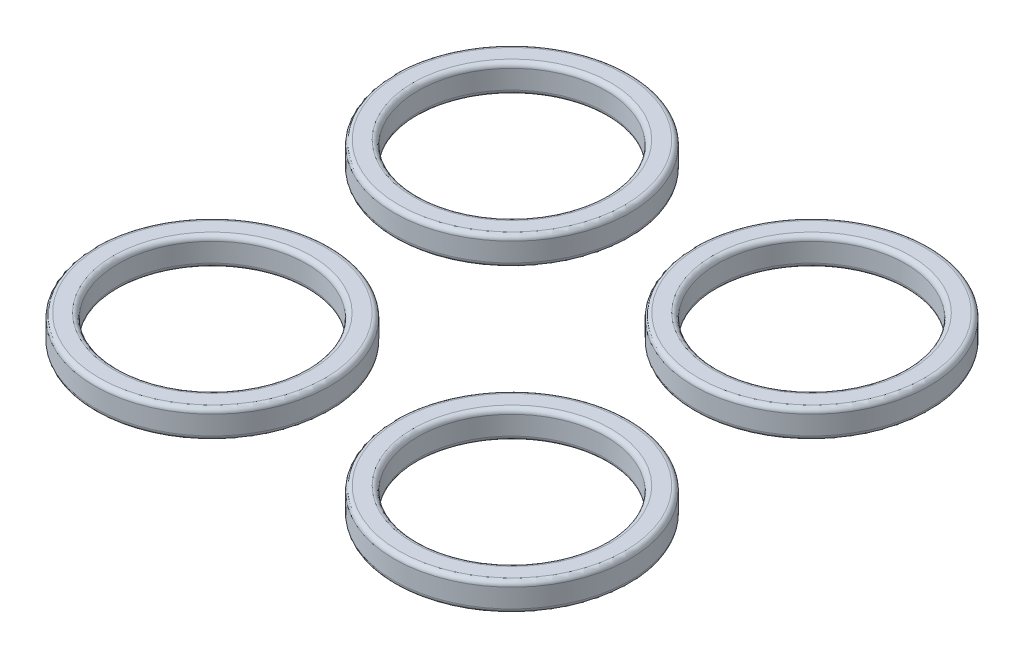
ISO-10303-21;
HEADER;
FILE_DESCRIPTION(('STEP AP214'),'2;1');
FILE_NAME('part.step','',(''),(''),'','','');
FILE_SCHEMA(('AUTOMOTIVE_DESIGN { 1 0 10303 214 1 1 1 1 }'));
ENDSEC;
DATA;
#1=APPLICATION_CONTEXT('core data for automotive mechanical design processes');
#2=APPLICATION_PROTOCOL_DEFINITION('international standard','automotive_design',2000,#1);
#3=PRODUCT_CONTEXT('',#1,'mechanical');
#4=PRODUCT('Part','Part','',(#3));
#5=PRODUCT_RELATED_PRODUCT_CATEGORY('part','',(#4));
#6=PRODUCT_DEFINITION_FORMATION('','',#4);
#7=PRODUCT_DEFINITION_CONTEXT('part definition',#1,'design');
#8=PRODUCT_DEFINITION('design','',#6,#7);
#9=PRODUCT_DEFINITION_SHAPE('','',#8);
#10=(LENGTH_UNIT() NAMED_UNIT(*) SI_UNIT(.MILLI.,.METRE.));
#11=(NAMED_UNIT(*) PLANE_ANGLE_UNIT() SI_UNIT($,.RADIAN.));
#12=(NAMED_UNIT(*) SI_UNIT($,.STERADIAN.) SOLID_ANGLE_UNIT());
#13=UNCERTAINTY_MEASURE_WITH_UNIT(LENGTH_MEASURE(1.E-05),#10,'distance_accuracy_value','');
#14=(GEOMETRIC_REPRESENTATION_CONTEXT(3) GLOBAL_UNCERTAINTY_ASSIGNED_CONTEXT((#13)) GLOBAL_UNIT_ASSIGNED_CONTEXT((#10,
#11,#12)) REPRESENTATION_CONTEXT('',''));
#15=CARTESIAN_POINT('',(0.,0.,0.));
#16=DIRECTION('',(0.,0.,1.));
#17=DIRECTION('',(1.,0.,0.));
#18=AXIS2_PLACEMENT_3D('',#15,#16,#17);
#19=CARTESIAN_POINT('',(159.099025766973,30.,159.099025766973));
#20=DIRECTION('',(0.,1.,0.));
#21=DIRECTION('',(0.,0.,1.));
#22=AXIS2_PLACEMENT_3D('',#19,#20,#21);
#23=PLANE('',#22);
#24=CARTESIAN_POINT('',(159.099025766973,30.,159.099025766973));
#25=DIRECTION('',(0.,1.,0.));
#26=DIRECTION('',(0.,0.,1.));
#27=AXIS2_PLACEMENT_3D('',#24,#25,#26);
#28=CIRCLE('',#27,105.);
#29=CARTESIAN_POINT('',(159.099025766973,30.,264.099025766973));
#30=VERTEX_POINT('',#29);
#31=EDGE_CURVE('E11',#30,#30,#28,.F.);
#32=ORIENTED_EDGE('',*,*,#31,.T.);
#33=EDGE_LOOP('',(#32));
#34=FACE_BOUND('',#33,.T.);
#35=CARTESIAN_POINT('',(159.099025766973,30.,159.099025766973));
#36=DIRECTION('',(0.,1.,0.));
#37=DIRECTION('',(0.,0.,1.));
#38=AXIS2_PLACEMENT_3D('',#35,#36,#37);
#39=CIRCLE('',#38,120.);
#40=CARTESIAN_POINT('',(159.099025766973,30.,279.099025766974));
#41=VERTEX_POINT('',#40);
#42=EDGE_CURVE('E47',#41,#41,#39,.T.);
#43=ORIENTED_EDGE('',*,*,#42,.T.);
#44=EDGE_LOOP('',(#43));
#45=FACE_BOUND('',#44,.T.);
#46=ADVANCED_FACE('F40',(#34,#45),#23,.T.);
#47=CARTESIAN_POINT('',(159.099025766973,0.,159.099025766973));
#48=DIRECTION('',(0.,1.,0.));
#49=DIRECTION('',(0.,0.,1.));
#50=AXIS2_PLACEMENT_3D('',#47,#48,#49);
#51=PLANE('',#50);
#52=CARTESIAN_POINT('',(159.099025766973,0.,159.099025766973));
#53=DIRECTION('',(0.,1.,0.));
#54=DIRECTION('',(0.,0.,1.));
#55=AXIS2_PLACEMENT_3D('',#52,#53,#54);
#56=CIRCLE('',#55,105.);
#57=CARTESIAN_POINT('',(159.099025766973,0.,264.099025766973));
#58=VERTEX_POINT('',#57);
#59=EDGE_CURVE('E66',#58,#58,#56,.T.);
#60=ORIENTED_EDGE('',*,*,#59,.T.);
#61=EDGE_LOOP('',(#60));
#62=FACE_BOUND('',#61,.T.);
#63=CARTESIAN_POINT('',(159.099025766973,0.,159.099025766973));
#64=DIRECTION('',(0.,1.,0.));
#65=DIRECTION('',(0.,0.,1.));
#66=AXIS2_PLACEMENT_3D('',#63,#64,#65);
#67=CIRCLE('',#66,120.);
#68=CARTESIAN_POINT('',(159.099025766973,0.,279.099025766974));
#69=VERTEX_POINT('',#68);
#70=EDGE_CURVE('E69',#69,#69,#67,.F.);
#71=ORIENTED_EDGE('',*,*,#70,.T.);
#72=EDGE_LOOP('',(#71));
#73=FACE_BOUND('',#72,.T.);
#74=ADVANCED_FACE('F73',(#62,#73),#51,.F.);
#75=CARTESIAN_POINT('',(159.099025766973,30.,159.099025766973));
#76=DIRECTION('',(0.,-1.,0.));
#77=DIRECTION('',(0.,0.,-1.));
#78=AXIS2_PLACEMENT_3D('',#75,#76,#77);
#79=CYLINDRICAL_SURFACE('',#78,125.);
#80=CARTESIAN_POINT('',(159.099025766973,5.,159.099025766973));
#81=DIRECTION('',(0.,1.,0.));
#82=DIRECTION('',(0.,0.,1.));
#83=AXIS2_PLACEMENT_3D('',#80,#81,#82);
#84=CIRCLE('',#83,125.);
#85=CARTESIAN_POINT('',(159.099025766973,5.,284.099025766974));
#86=VERTEX_POINT('',#85);
#87=EDGE_CURVE('E51',#86,#86,#84,.T.);
#88=ORIENTED_EDGE('',*,*,#87,.T.);
#89=EDGE_LOOP('',(#88));
#90=FACE_BOUND('',#89,.T.);
#91=CARTESIAN_POINT('',(159.099025766973,25.,159.099025766973));
#92=DIRECTION('',(0.,1.,0.));
#93=DIRECTION('',(0.,0.,1.));
#94=AXIS2_PLACEMENT_3D('',#91,#92,#93);
#95=CIRCLE('',#94,125.);
#96=CARTESIAN_POINT('',(159.099025766973,25.,284.099025766974));
#97=VERTEX_POINT('',#96);
#98=EDGE_CURVE('E55',#97,#97,#95,.F.);
#99=ORIENTED_EDGE('',*,*,#98,.T.);
#100=EDGE_LOOP('',(#99));
#101=FACE_BOUND('',#100,.T.);
#102=ADVANCED_FACE('F83',(#90,#101),#79,.T.);
#103=CARTESIAN_POINT('',(159.099025766973,30.,159.099025766973));
#104=DIRECTION('',(0.,-1.,0.));
#105=DIRECTION('',(0.,0.,-1.));
#106=AXIS2_PLACEMENT_3D('',#103,#104,#105);
#107=CYLINDRICAL_SURFACE('',#106,100.);
#108=CARTESIAN_POINT('',(159.099025766973,5.,159.099025766973));
#109=DIRECTION('',(0.,1.,0.));
#110=DIRECTION('',(0.,0.,1.));
#111=AXIS2_PLACEMENT_3D('',#108,#109,#110);
#112=CIRCLE('',#111,100.);
#113=CARTESIAN_POINT('',(159.099025766973,5.,259.099025766973));
#114=VERTEX_POINT('',#113);
#115=EDGE_CURVE('E60',#114,#114,#112,.F.);
#116=ORIENTED_EDGE('',*,*,#115,.T.);
#117=EDGE_LOOP('',(#116));
#118=FACE_BOUND('',#117,.T.);
#119=CARTESIAN_POINT('',(159.099025766973,25.,159.099025766973));
#120=DIRECTION('',(0.,1.,0.));
#121=DIRECTION('',(0.,0.,1.));
#122=AXIS2_PLACEMENT_3D('',#119,#120,#121);
#123=CIRCLE('',#122,100.);
#124=CARTESIAN_POINT('',(159.099025766973,25.,259.099025766973));
#125=VERTEX_POINT('',#124);
#126=EDGE_CURVE('E63',#125,#125,#123,.T.);
#127=ORIENTED_EDGE('',*,*,#126,.T.);
#128=EDGE_LOOP('',(#127));
#129=FACE_BOUND('',#128,.T.);
#130=ADVANCED_FACE('F86',(#118,#129),#107,.F.);
#131=CARTESIAN_POINT('',(159.099025766973,5.,159.099025766973));
#132=DIRECTION('',(0.,1.,0.));
#133=DIRECTION('',(0.,0.,1.));
#134=AXIS2_PLACEMENT_3D('',#131,#132,#133);
#135=TOROIDAL_SURFACE('',#134,105.,5.);
#136=ORIENTED_EDGE('',*,*,#115,.F.);
#137=EDGE_LOOP('',(#136));
#138=FACE_BOUND('',#137,.T.);
#139=ORIENTED_EDGE('',*,*,#59,.F.);
#140=EDGE_LOOP('',(#139));
#141=FACE_BOUND('',#140,.T.);
#142=ADVANCED_FACE('F79',(#138,#141),#135,.T.);
#143=CARTESIAN_POINT('',(159.099025766973,5.,159.099025766973));
#144=DIRECTION('',(0.,1.,0.));
#145=DIRECTION('',(0.,0.,1.));
#146=AXIS2_PLACEMENT_3D('',#143,#144,#145);
#147=TOROIDAL_SURFACE('',#146,120.,5.);
#148=ORIENTED_EDGE('',*,*,#70,.F.);
#149=EDGE_LOOP('',(#148));
#150=FACE_BOUND('',#149,.T.);
#151=ORIENTED_EDGE('',*,*,#87,.F.);
#152=EDGE_LOOP('',(#151));
#153=FACE_BOUND('',#152,.T.);
#154=ADVANCED_FACE('F75',(#150,#153),#147,.T.);
#155=CARTESIAN_POINT('',(159.099025766973,25.,159.099025766973));
#156=DIRECTION('',(0.,1.,0.));
#157=DIRECTION('',(0.,0.,1.));
#158=AXIS2_PLACEMENT_3D('',#155,#156,#157);
#159=TOROIDAL_SURFACE('',#158,105.,5.);
#160=ORIENTED_EDGE('',*,*,#31,.F.);
#161=EDGE_LOOP('',(#160));
#162=FACE_BOUND('',#161,.T.);
#163=ORIENTED_EDGE('',*,*,#126,.F.);
#164=EDGE_LOOP('',(#163));
#165=FACE_BOUND('',#164,.T.);
#166=ADVANCED_FACE('F78',(#162,#165),#159,.T.);
#167=CARTESIAN_POINT('',(159.099025766973,25.,159.099025766973));
#168=DIRECTION('',(0.,1.,0.));
#169=DIRECTION('',(0.,0.,1.));
#170=AXIS2_PLACEMENT_3D('',#167,#168,#169);
#171=TOROIDAL_SURFACE('',#170,120.,5.);
#172=ORIENTED_EDGE('',*,*,#98,.F.);
#173=EDGE_LOOP('',(#172));
#174=FACE_BOUND('',#173,.T.);
#175=ORIENTED_EDGE('',*,*,#42,.F.);
#176=EDGE_LOOP('',(#175));
#177=FACE_BOUND('',#176,.T.);
#178=ADVANCED_FACE('F42',(#174,#177),#171,.T.);
#179=CLOSED_SHELL('',(#46,#74,#102,#130,#142,#154,#166,#178));
#180=MANIFOLD_SOLID_BREP('B2',#179);
#181=CARTESIAN_POINT('',(-159.099025766973,30.,159.099025766973));
#182=DIRECTION('',(0.,1.,0.));
#183=DIRECTION('',(0.,0.,1.));
#184=AXIS2_PLACEMENT_3D('',#181,#182,#183);
#185=PLANE('',#184);
#186=CARTESIAN_POINT('',(-159.099025766973,30.,159.099025766973));
#187=DIRECTION('',(0.,1.,0.));
#188=DIRECTION('',(0.,0.,1.));
#189=AXIS2_PLACEMENT_3D('',#186,#187,#188);
#190=CIRCLE('',#189,105.);
#191=CARTESIAN_POINT('',(-159.099025766973,30.,264.099025766973));
#192=VERTEX_POINT('',#191);
#193=EDGE_CURVE('E39',#192,#192,#190,.F.);
#194=ORIENTED_EDGE('',*,*,#193,.T.);
#195=EDGE_LOOP('',(#194));
#196=FACE_BOUND('',#195,.T.);
#197=CARTESIAN_POINT('',(-159.099025766973,30.,159.099025766973));
#198=DIRECTION('',(0.,1.,0.));
#199=DIRECTION('',(0.,0.,1.));
#200=AXIS2_PLACEMENT_3D('',#197,#198,#199);
#201=CIRCLE('',#200,120.);
#202=CARTESIAN_POINT('',(-159.099025766973,30.,279.099025766973));
#203=VERTEX_POINT('',#202);
#204=EDGE_CURVE('E177',#203,#203,#201,.T.);
#205=ORIENTED_EDGE('',*,*,#204,.T.);
#206=EDGE_LOOP('',(#205));
#207=FACE_BOUND('',#206,.T.);
#208=ADVANCED_FACE('F170',(#196,#207),#185,.T.);
#209=CARTESIAN_POINT('',(-159.099025766973,0.,159.099025766973));
#210=DIRECTION('',(0.,1.,0.));
#211=DIRECTION('',(0.,0.,1.));
#212=AXIS2_PLACEMENT_3D('',#209,#210,#211);
#213=PLANE('',#212);
#214=CARTESIAN_POINT('',(-159.099025766973,0.,159.099025766973));
#215=DIRECTION('',(0.,1.,0.));
#216=DIRECTION('',(0.,0.,1.));
#217=AXIS2_PLACEMENT_3D('',#214,#215,#216);
#218=CIRCLE('',#217,105.);
#219=CARTESIAN_POINT('',(-159.099025766973,0.,264.099025766973));
#220=VERTEX_POINT('',#219);
#221=EDGE_CURVE('E196',#220,#220,#218,.T.);
#222=ORIENTED_EDGE('',*,*,#221,.T.);
#223=EDGE_LOOP('',(#222));
#224=FACE_BOUND('',#223,.T.);
#225=CARTESIAN_POINT('',(-159.099025766973,0.,159.099025766973));
#226=DIRECTION('',(0.,1.,0.));
#227=DIRECTION('',(0.,0.,1.));
#228=AXIS2_PLACEMENT_3D('',#225,#226,#227);
#229=CIRCLE('',#228,120.);
#230=CARTESIAN_POINT('',(-159.099025766973,0.,279.099025766973));
#231=VERTEX_POINT('',#230);
#232=EDGE_CURVE('E199',#231,#231,#229,.F.);
#233=ORIENTED_EDGE('',*,*,#232,.T.);
#234=EDGE_LOOP('',(#233));
#235=FACE_BOUND('',#234,.T.);
#236=ADVANCED_FACE('F203',(#224,#235),#213,.F.);
#237=CARTESIAN_POINT('',(-159.099025766973,30.,159.099025766973));
#238=DIRECTION('',(0.,-1.,0.));
#239=DIRECTION('',(0.,0.,-1.));
#240=AXIS2_PLACEMENT_3D('',#237,#238,#239);
#241=CYLINDRICAL_SURFACE('',#240,125.);
#242=CARTESIAN_POINT('',(-159.099025766973,5.,159.099025766973));
#243=DIRECTION('',(0.,1.,0.));
#244=DIRECTION('',(0.,0.,1.));
#245=AXIS2_PLACEMENT_3D('',#242,#243,#244);
#246=CIRCLE('',#245,125.);
#247=CARTESIAN_POINT('',(-159.099025766973,5.,284.099025766973));
#248=VERTEX_POINT('',#247);
#249=EDGE_CURVE('E181',#248,#248,#246,.T.);
#250=ORIENTED_EDGE('',*,*,#249,.T.);
#251=EDGE_LOOP('',(#250));
#252=FACE_BOUND('',#251,.T.);
#253=CARTESIAN_POINT('',(-159.099025766973,25.,159.099025766973));
#254=DIRECTION('',(0.,1.,0.));
#255=DIRECTION('',(0.,0.,1.));
#256=AXIS2_PLACEMENT_3D('',#253,#254,#255);
#257=CIRCLE('',#256,125.);
#258=CARTESIAN_POINT('',(-159.099025766973,25.,284.099025766973));
#259=VERTEX_POINT('',#258);
#260=EDGE_CURVE('E185',#259,#259,#257,.F.);
#261=ORIENTED_EDGE('',*,*,#260,.T.);
#262=EDGE_LOOP('',(#261));
#263=FACE_BOUND('',#262,.T.);
#264=ADVANCED_FACE('F213',(#252,#263),#241,.T.);
#265=CARTESIAN_POINT('',(-159.099025766973,30.,159.099025766973));
#266=DIRECTION('',(0.,-1.,0.));
#267=DIRECTION('',(0.,0.,-1.));
#268=AXIS2_PLACEMENT_3D('',#265,#266,#267);
#269=CYLINDRICAL_SURFACE('',#268,100.);
#270=CARTESIAN_POINT('',(-159.099025766973,5.,159.099025766973));
#271=DIRECTION('',(0.,1.,0.));
#272=DIRECTION('',(0.,0.,1.));
#273=AXIS2_PLACEMENT_3D('',#270,#271,#272);
#274=CIRCLE('',#273,100.);
#275=CARTESIAN_POINT('',(-159.099025766973,5.,259.099025766973));
#276=VERTEX_POINT('',#275);
#277=EDGE_CURVE('E190',#276,#276,#274,.F.);
#278=ORIENTED_EDGE('',*,*,#277,.T.);
#279=EDGE_LOOP('',(#278));
#280=FACE_BOUND('',#279,.T.);
#281=CARTESIAN_POINT('',(-159.099025766973,25.,159.099025766973));
#282=DIRECTION('',(0.,1.,0.));
#283=DIRECTION('',(0.,0.,1.));
#284=AXIS2_PLACEMENT_3D('',#281,#282,#283);
#285=CIRCLE('',#284,100.);
#286=CARTESIAN_POINT('',(-159.099025766973,25.,259.099025766973));
#287=VERTEX_POINT('',#286);
#288=EDGE_CURVE('E193',#287,#287,#285,.T.);
#289=ORIENTED_EDGE('',*,*,#288,.T.);
#290=EDGE_LOOP('',(#289));
#291=FACE_BOUND('',#290,.T.);
#292=ADVANCED_FACE('F216',(#280,#291),#269,.F.);
#293=CARTESIAN_POINT('',(-159.099025766973,5.,159.099025766973));
#294=DIRECTION('',(0.,1.,0.));
#295=DIRECTION('',(0.,0.,1.));
#296=AXIS2_PLACEMENT_3D('',#293,#294,#295);
#297=TOROIDAL_SURFACE('',#296,105.,5.);
#298=ORIENTED_EDGE('',*,*,#277,.F.);
#299=EDGE_LOOP('',(#298));
#300=FACE_BOUND('',#299,.T.);
#301=ORIENTED_EDGE('',*,*,#221,.F.);
#302=EDGE_LOOP('',(#301));
#303=FACE_BOUND('',#302,.T.);
#304=ADVANCED_FACE('F209',(#300,#303),#297,.T.);
#305=CARTESIAN_POINT('',(-159.099025766973,5.,159.099025766973));
#306=DIRECTION('',(0.,1.,0.));
#307=DIRECTION('',(0.,0.,1.));
#308=AXIS2_PLACEMENT_3D('',#305,#306,#307);
#309=TOROIDAL_SURFACE('',#308,120.,5.);
#310=ORIENTED_EDGE('',*,*,#232,.F.);
#311=EDGE_LOOP('',(#310));
#312=FACE_BOUND('',#311,.T.);
#313=ORIENTED_EDGE('',*,*,#249,.F.);
#314=EDGE_LOOP('',(#313));
#315=FACE_BOUND('',#314,.T.);
#316=ADVANCED_FACE('F205',(#312,#315),#309,.T.);
#317=CARTESIAN_POINT('',(-159.099025766973,25.,159.099025766973));
#318=DIRECTION('',(0.,1.,0.));
#319=DIRECTION('',(0.,0.,1.));
#320=AXIS2_PLACEMENT_3D('',#317,#318,#319);
#321=TOROIDAL_SURFACE('',#320,105.,5.);
#322=ORIENTED_EDGE('',*,*,#193,.F.);
#323=EDGE_LOOP('',(#322));
#324=FACE_BOUND('',#323,.T.);
#325=ORIENTED_EDGE('',*,*,#288,.F.);
#326=EDGE_LOOP('',(#325));
#327=FACE_BOUND('',#326,.T.);
#328=ADVANCED_FACE('F208',(#324,#327),#321,.T.);
#329=CARTESIAN_POINT('',(-159.099025766973,25.,159.099025766973));
#330=DIRECTION('',(0.,1.,0.));
#331=DIRECTION('',(0.,0.,1.));
#332=AXIS2_PLACEMENT_3D('',#329,#330,#331);
#333=TOROIDAL_SURFACE('',#332,120.,5.);
#334=ORIENTED_EDGE('',*,*,#260,.F.);
#335=EDGE_LOOP('',(#334));
#336=FACE_BOUND('',#335,.T.);
#337=ORIENTED_EDGE('',*,*,#204,.F.);
#338=EDGE_LOOP('',(#337));
#339=FACE_BOUND('',#338,.T.);
#340=ADVANCED_FACE('F172',(#336,#339),#333,.T.);
#341=CLOSED_SHELL('',(#208,#236,#264,#292,#304,#316,#328,#340));
#342=MANIFOLD_SOLID_BREP('B6',#341);
#343=CARTESIAN_POINT('',(159.099025766973,30.,-159.099025766974));
#344=DIRECTION('',(0.,1.,0.));
#345=DIRECTION('',(0.,0.,1.));
#346=AXIS2_PLACEMENT_3D('',#343,#344,#345);
#347=PLANE('',#346);
#348=CARTESIAN_POINT('',(159.099025766973,30.,-159.099025766974));
#349=DIRECTION('',(0.,1.,0.));
#350=DIRECTION('',(0.,0.,1.));
#351=AXIS2_PLACEMENT_3D('',#348,#349,#350);
#352=CIRCLE('',#351,105.);
#353=CARTESIAN_POINT('',(159.099025766973,30.,-54.0990257669735));
#354=VERTEX_POINT('',#353);
#355=EDGE_CURVE('E169',#354,#354,#352,.F.);
#356=ORIENTED_EDGE('',*,*,#355,.T.);
#357=EDGE_LOOP('',(#356));
#358=FACE_BOUND('',#357,.T.);
#359=CARTESIAN_POINT('',(159.099025766973,30.,-159.099025766974));
#360=DIRECTION('',(0.,1.,0.));
#361=DIRECTION('',(0.,0.,1.));
#362=AXIS2_PLACEMENT_3D('',#359,#360,#361);
#363=CIRCLE('',#362,120.);
#364=CARTESIAN_POINT('',(159.099025766973,30.,-39.0990257669735));
#365=VERTEX_POINT('',#364);
#366=EDGE_CURVE('E306',#365,#365,#363,.T.);
#367=ORIENTED_EDGE('',*,*,#366,.T.);
#368=EDGE_LOOP('',(#367));
#369=FACE_BOUND('',#368,.T.);
#370=ADVANCED_FACE('F299',(#358,#369),#347,.T.);
#371=CARTESIAN_POINT('',(159.099025766973,0.,-159.099025766974));
#372=DIRECTION('',(0.,1.,0.));
#373=DIRECTION('',(0.,0.,1.));
#374=AXIS2_PLACEMENT_3D('',#371,#372,#373);
#375=PLANE('',#374);
#376=CARTESIAN_POINT('',(159.099025766973,0.,-159.099025766974));
#377=DIRECTION('',(0.,1.,0.));
#378=DIRECTION('',(0.,0.,1.));
#379=AXIS2_PLACEMENT_3D('',#376,#377,#378);
#380=CIRCLE('',#379,105.);
#381=CARTESIAN_POINT('',(159.099025766973,0.,-54.0990257669735));
#382=VERTEX_POINT('',#381);
#383=EDGE_CURVE('E325',#382,#382,#380,.T.);
#384=ORIENTED_EDGE('',*,*,#383,.T.);
#385=EDGE_LOOP('',(#384));
#386=FACE_BOUND('',#385,.T.);
#387=CARTESIAN_POINT('',(159.099025766973,0.,-159.099025766974));
#388=DIRECTION('',(0.,1.,0.));
#389=DIRECTION('',(0.,0.,1.));
#390=AXIS2_PLACEMENT_3D('',#387,#388,#389);
#391=CIRCLE('',#390,120.);
#392=CARTESIAN_POINT('',(159.099025766973,0.,-39.0990257669735));
#393=VERTEX_POINT('',#392);
#394=EDGE_CURVE('E328',#393,#393,#391,.F.);
#395=ORIENTED_EDGE('',*,*,#394,.T.);
#396=EDGE_LOOP('',(#395));
#397=FACE_BOUND('',#396,.T.);
#398=ADVANCED_FACE('F332',(#386,#397),#375,.F.);
#399=CARTESIAN_POINT('',(159.099025766973,30.,-159.099025766974));
#400=DIRECTION('',(0.,-1.,0.));
#401=DIRECTION('',(0.,0.,-1.));
#402=AXIS2_PLACEMENT_3D('',#399,#400,#401);
#403=CYLINDRICAL_SURFACE('',#402,125.);
#404=CARTESIAN_POINT('',(159.099025766973,5.,-159.099025766974));
#405=DIRECTION('',(0.,1.,0.));
#406=DIRECTION('',(0.,0.,1.));
#407=AXIS2_PLACEMENT_3D('',#404,#405,#406);
#408=CIRCLE('',#407,125.);
#409=CARTESIAN_POINT('',(159.099025766973,5.,-34.0990257669735));
#410=VERTEX_POINT('',#409);
#411=EDGE_CURVE('E310',#410,#410,#408,.T.);
#412=ORIENTED_EDGE('',*,*,#411,.T.);
#413=EDGE_LOOP('',(#412));
#414=FACE_BOUND('',#413,.T.);
#415=CARTESIAN_POINT('',(159.099025766973,25.,-159.099025766974));
#416=DIRECTION('',(0.,1.,0.));
#417=DIRECTION('',(0.,0.,1.));
#418=AXIS2_PLACEMENT_3D('',#415,#416,#417);
#419=CIRCLE('',#418,125.);
#420=CARTESIAN_POINT('',(159.099025766973,25.,-34.0990257669735));
#421=VERTEX_POINT('',#420);
#422=EDGE_CURVE('E314',#421,#421,#419,.F.);
#423=ORIENTED_EDGE('',*,*,#422,.T.);
#424=EDGE_LOOP('',(#423));
#425=FACE_BOUND('',#424,.T.);
#426=ADVANCED_FACE('F342',(#414,#425),#403,.T.);
#427=CARTESIAN_POINT('',(159.099025766973,30.,-159.099025766974));
#428=DIRECTION('',(0.,-1.,0.));
#429=DIRECTION('',(0.,0.,-1.));
#430=AXIS2_PLACEMENT_3D('',#427,#428,#429);
#431=CYLINDRICAL_SURFACE('',#430,100.);
#432=CARTESIAN_POINT('',(159.099025766973,5.,-159.099025766974));
#433=DIRECTION('',(0.,1.,0.));
#434=DIRECTION('',(0.,0.,1.));
#435=AXIS2_PLACEMENT_3D('',#432,#433,#434);
#436=CIRCLE('',#435,100.);
#437=CARTESIAN_POINT('',(159.099025766973,5.,-59.0990257669735));
#438=VERTEX_POINT('',#437);
#439=EDGE_CURVE('E319',#438,#438,#436,.F.);
#440=ORIENTED_EDGE('',*,*,#439,.T.);
#441=EDGE_LOOP('',(#440));
#442=FACE_BOUND('',#441,.T.);
#443=CARTESIAN_POINT('',(159.099025766973,25.,-159.099025766974));
#444=DIRECTION('',(0.,1.,0.));
#445=DIRECTION('',(0.,0.,1.));
#446=AXIS2_PLACEMENT_3D('',#443,#444,#445);
#447=CIRCLE('',#446,100.);
#448=CARTESIAN_POINT('',(159.099025766973,25.,-59.0990257669735));
#449=VERTEX_POINT('',#448);
#450=EDGE_CURVE('E322',#449,#449,#447,.T.);
#451=ORIENTED_EDGE('',*,*,#450,.T.);
#452=EDGE_LOOP('',(#451));
#453=FACE_BOUND('',#452,.T.);
#454=ADVANCED_FACE('F345',(#442,#453),#431,.F.);
#455=CARTESIAN_POINT('',(159.099025766973,5.,-159.099025766974));
#456=DIRECTION('',(0.,1.,0.));
#457=DIRECTION('',(0.,0.,1.));
#458=AXIS2_PLACEMENT_3D('',#455,#456,#457);
#459=TOROIDAL_SURFACE('',#458,105.,5.);
#460=ORIENTED_EDGE('',*,*,#439,.F.);
#461=EDGE_LOOP('',(#460));
#462=FACE_BOUND('',#461,.T.);
#463=ORIENTED_EDGE('',*,*,#383,.F.);
#464=EDGE_LOOP('',(#463));
#465=FACE_BOUND('',#464,.T.);
#466=ADVANCED_FACE('F338',(#462,#465),#459,.T.);
#467=CARTESIAN_POINT('',(159.099025766973,5.,-159.099025766974));
#468=DIRECTION('',(0.,1.,0.));
#469=DIRECTION('',(0.,0.,1.));
#470=AXIS2_PLACEMENT_3D('',#467,#468,#469);
#471=TOROIDAL_SURFACE('',#470,120.,5.);
#472=ORIENTED_EDGE('',*,*,#394,.F.);
#473=EDGE_LOOP('',(#472));
#474=FACE_BOUND('',#473,.T.);
#475=ORIENTED_EDGE('',*,*,#411,.F.);
#476=EDGE_LOOP('',(#475));
#477=FACE_BOUND('',#476,.T.);
#478=ADVANCED_FACE('F334',(#474,#477),#471,.T.);
#479=CARTESIAN_POINT('',(159.099025766973,25.,-159.099025766974));
#480=DIRECTION('',(0.,1.,0.));
#481=DIRECTION('',(0.,0.,1.));
#482=AXIS2_PLACEMENT_3D('',#479,#480,#481);
#483=TOROIDAL_SURFACE('',#482,105.,5.);
#484=ORIENTED_EDGE('',*,*,#355,.F.);
#485=EDGE_LOOP('',(#484));
#486=FACE_BOUND('',#485,.T.);
#487=ORIENTED_EDGE('',*,*,#450,.F.);
#488=EDGE_LOOP('',(#487));
#489=FACE_BOUND('',#488,.T.);
#490=ADVANCED_FACE('F337',(#486,#489),#483,.T.);
#491=CARTESIAN_POINT('',(159.099025766973,25.,-159.099025766974));
#492=DIRECTION('',(0.,1.,0.));
#493=DIRECTION('',(0.,0.,1.));
#494=AXIS2_PLACEMENT_3D('',#491,#492,#493);
#495=TOROIDAL_SURFACE('',#494,120.,5.);
#496=ORIENTED_EDGE('',*,*,#422,.F.);
#497=EDGE_LOOP('',(#496));
#498=FACE_BOUND('',#497,.T.);
#499=ORIENTED_EDGE('',*,*,#366,.F.);
#500=EDGE_LOOP('',(#499));
#501=FACE_BOUND('',#500,.T.);
#502=ADVANCED_FACE('F301',(#498,#501),#495,.T.);
#503=CLOSED_SHELL('',(#370,#398,#426,#454,#466,#478,#490,#502));
#504=MANIFOLD_SOLID_BREP('B34',#503);
#505=CARTESIAN_POINT('',(-159.099025766973,30.,-159.099025766974));
#506=DIRECTION('',(0.,1.,0.));
#507=DIRECTION('',(0.,0.,1.));
#508=AXIS2_PLACEMENT_3D('',#505,#506,#507);
#509=PLANE('',#508);
#510=CARTESIAN_POINT('',(-159.099025766973,30.,-159.099025766974));
#511=DIRECTION('',(0.,1.,0.));
#512=DIRECTION('',(0.,0.,1.));
#513=AXIS2_PLACEMENT_3D('',#510,#511,#512);
#514=CIRCLE('',#513,105.);
#515=CARTESIAN_POINT('',(-159.099025766973,30.,-54.0990257669735));
#516=VERTEX_POINT('',#515);
#517=EDGE_CURVE('E298',#516,#516,#514,.F.);
#518=ORIENTED_EDGE('',*,*,#517,.T.);
#519=EDGE_LOOP('',(#518));
#520=FACE_BOUND('',#519,.T.);
#521=CARTESIAN_POINT('',(-159.099025766973,30.,-159.099025766974));
#522=DIRECTION('',(0.,1.,0.));
#523=DIRECTION('',(0.,0.,1.));
#524=AXIS2_PLACEMENT_3D('',#521,#522,#523);
#525=CIRCLE('',#524,120.);
#526=CARTESIAN_POINT('',(-159.099025766973,30.,-39.0990257669735));
#527=VERTEX_POINT('',#526);
#528=EDGE_CURVE('E428',#527,#527,#525,.T.);
#529=ORIENTED_EDGE('',*,*,#528,.T.);
#530=EDGE_LOOP('',(#529));
#531=FACE_BOUND('',#530,.T.);
#532=ADVANCED_FACE('F421',(#520,#531),#509,.T.);
#533=CARTESIAN_POINT('',(-159.099025766973,0.,-159.099025766974));
#534=DIRECTION('',(0.,1.,0.));
#535=DIRECTION('',(0.,0.,1.));
#536=AXIS2_PLACEMENT_3D('',#533,#534,#535);
#537=PLANE('',#536);
#538=CARTESIAN_POINT('',(-159.099025766973,0.,-159.099025766974));
#539=DIRECTION('',(0.,1.,0.));
#540=DIRECTION('',(0.,0.,1.));
#541=AXIS2_PLACEMENT_3D('',#538,#539,#540);
#542=CIRCLE('',#541,105.);
#543=CARTESIAN_POINT('',(-159.099025766973,0.,-54.0990257669735));
#544=VERTEX_POINT('',#543);
#545=EDGE_CURVE('E447',#544,#544,#542,.T.);
#546=ORIENTED_EDGE('',*,*,#545,.T.);
#547=EDGE_LOOP('',(#546));
#548=FACE_BOUND('',#547,.T.);
#549=CARTESIAN_POINT('',(-159.099025766973,0.,-159.099025766974));
#550=DIRECTION('',(0.,1.,0.));
#551=DIRECTION('',(0.,0.,1.));
#552=AXIS2_PLACEMENT_3D('',#549,#550,#551);
#553=CIRCLE('',#552,120.);
#554=CARTESIAN_POINT('',(-159.099025766973,0.,-39.0990257669735));
#555=VERTEX_POINT('',#554);
#556=EDGE_CURVE('E450',#555,#555,#553,.F.);
#557=ORIENTED_EDGE('',*,*,#556,.T.);
#558=EDGE_LOOP('',(#557));
#559=FACE_BOUND('',#558,.T.);
#560=ADVANCED_FACE('F454',(#548,#559),#537,.F.);
#561=CARTESIAN_POINT('',(-159.099025766973,30.,-159.099025766974));
#562=DIRECTION('',(0.,-1.,0.));
#563=DIRECTION('',(0.,0.,-1.));
#564=AXIS2_PLACEMENT_3D('',#561,#562,#563);
#565=CYLINDRICAL_SURFACE('',#564,125.);
#566=CARTESIAN_POINT('',(-159.099025766973,5.,-159.099025766974));
#567=DIRECTION('',(0.,1.,0.));
#568=DIRECTION('',(0.,0.,1.));
#569=AXIS2_PLACEMENT_3D('',#566,#567,#568);
#570=CIRCLE('',#569,125.);
#571=CARTESIAN_POINT('',(-159.099025766973,5.,-34.0990257669735));
#572=VERTEX_POINT('',#571);
#573=EDGE_CURVE('E432',#572,#572,#570,.T.);
#574=ORIENTED_EDGE('',*,*,#573,.T.);
#575=EDGE_LOOP('',(#574));
#576=FACE_BOUND('',#575,.T.);
#577=CARTESIAN_POINT('',(-159.099025766973,25.,-159.099025766974));
#578=DIRECTION('',(0.,1.,0.));
#579=DIRECTION('',(0.,0.,1.));
#580=AXIS2_PLACEMENT_3D('',#577,#578,#579);
#581=CIRCLE('',#580,125.);
#582=CARTESIAN_POINT('',(-159.099025766973,25.,-34.0990257669735));
#583=VERTEX_POINT('',#582);
#584=EDGE_CURVE('E436',#583,#583,#581,.F.);
#585=ORIENTED_EDGE('',*,*,#584,.T.);
#586=EDGE_LOOP('',(#585));
#587=FACE_BOUND('',#586,.T.);
#588=ADVANCED_FACE('F464',(#576,#587),#565,.T.);
#589=CARTESIAN_POINT('',(-159.099025766973,30.,-159.099025766974));
#590=DIRECTION('',(0.,-1.,0.));
#591=DIRECTION('',(0.,0.,-1.));
#592=AXIS2_PLACEMENT_3D('',#589,#590,#591);
#593=CYLINDRICAL_SURFACE('',#592,100.);
#594=CARTESIAN_POINT('',(-159.099025766973,5.,-159.099025766974));
#595=DIRECTION('',(0.,1.,0.));
#596=DIRECTION('',(0.,0.,1.));
#597=AXIS2_PLACEMENT_3D('',#594,#595,#596);
#598=CIRCLE('',#597,100.);
#599=CARTESIAN_POINT('',(-159.099025766973,5.,-59.0990257669735));
#600=VERTEX_POINT('',#599);
#601=EDGE_CURVE('E441',#600,#600,#598,.F.);
#602=ORIENTED_EDGE('',*,*,#601,.T.);
#603=EDGE_LOOP('',(#602));
#604=FACE_BOUND('',#603,.T.);
#605=CARTESIAN_POINT('',(-159.099025766973,25.,-159.099025766974));
#606=DIRECTION('',(0.,1.,0.));
#607=DIRECTION('',(0.,0.,1.));
#608=AXIS2_PLACEMENT_3D('',#605,#606,#607);
#609=CIRCLE('',#608,100.);
#610=CARTESIAN_POINT('',(-159.099025766973,25.,-59.0990257669735));
#611=VERTEX_POINT('',#610);
#612=EDGE_CURVE('E444',#611,#611,#609,.T.);
#613=ORIENTED_EDGE('',*,*,#612,.T.);
#614=EDGE_LOOP('',(#613));
#615=FACE_BOUND('',#614,.T.);
#616=ADVANCED_FACE('F467',(#604,#615),#593,.F.);
#617=CARTESIAN_POINT('',(-159.099025766973,5.,-159.099025766974));
#618=DIRECTION('',(0.,1.,0.));
#619=DIRECTION('',(0.,0.,1.));
#620=AXIS2_PLACEMENT_3D('',#617,#618,#619);
#621=TOROIDAL_SURFACE('',#620,105.,5.);
#622=ORIENTED_EDGE('',*,*,#601,.F.);
#623=EDGE_LOOP('',(#622));
#624=FACE_BOUND('',#623,.T.);
#625=ORIENTED_EDGE('',*,*,#545,.F.);
#626=EDGE_LOOP('',(#625));
#627=FACE_BOUND('',#626,.T.);
#628=ADVANCED_FACE('F460',(#624,#627),#621,.T.);
#629=CARTESIAN_POINT('',(-159.099025766973,5.,-159.099025766974));
#630=DIRECTION('',(0.,1.,0.));
#631=DIRECTION('',(0.,0.,1.));
#632=AXIS2_PLACEMENT_3D('',#629,#630,#631);
#633=TOROIDAL_SURFACE('',#632,120.,5.);
#634=ORIENTED_EDGE('',*,*,#556,.F.);
#635=EDGE_LOOP('',(#634));
#636=FACE_BOUND('',#635,.T.);
#637=ORIENTED_EDGE('',*,*,#573,.F.);
#638=EDGE_LOOP('',(#637));
#639=FACE_BOUND('',#638,.T.);
#640=ADVANCED_FACE('F456',(#636,#639),#633,.T.);
#641=CARTESIAN_POINT('',(-159.099025766973,25.,-159.099025766974));
#642=DIRECTION('',(0.,1.,0.));
#643=DIRECTION('',(0.,0.,1.));
#644=AXIS2_PLACEMENT_3D('',#641,#642,#643);
#645=TOROIDAL_SURFACE('',#644,105.,5.);
#646=ORIENTED_EDGE('',*,*,#517,.F.);
#647=EDGE_LOOP('',(#646));
#648=FACE_BOUND('',#647,.T.);
#649=ORIENTED_EDGE('',*,*,#612,.F.);
#650=EDGE_LOOP('',(#649));
#651=FACE_BOUND('',#650,.T.);
#652=ADVANCED_FACE('F459',(#648,#651),#645,.T.);
#653=CARTESIAN_POINT('',(-159.099025766973,25.,-159.099025766974));
#654=DIRECTION('',(0.,1.,0.));
#655=DIRECTION('',(0.,0.,1.));
#656=AXIS2_PLACEMENT_3D('',#653,#654,#655);
#657=TOROIDAL_SURFACE('',#656,120.,5.);
#658=ORIENTED_EDGE('',*,*,#584,.F.);
#659=EDGE_LOOP('',(#658));
#660=FACE_BOUND('',#659,.T.);
#661=ORIENTED_EDGE('',*,*,#528,.F.);
#662=EDGE_LOOP('',(#661));
#663=FACE_BOUND('',#662,.T.);
#664=ADVANCED_FACE('F423',(#660,#663),#657,.T.);
#665=CLOSED_SHELL('',(#532,#560,#588,#616,#628,#640,#652,#664));
#666=MANIFOLD_SOLID_BREP('B164',#665);
#667=ADVANCED_BREP_SHAPE_REPRESENTATION('',(#18,#180,#342,#504,#666),#14);
#668=SHAPE_DEFINITION_REPRESENTATION(#9,#667);
ENDSEC;
END-ISO-10303-21;
